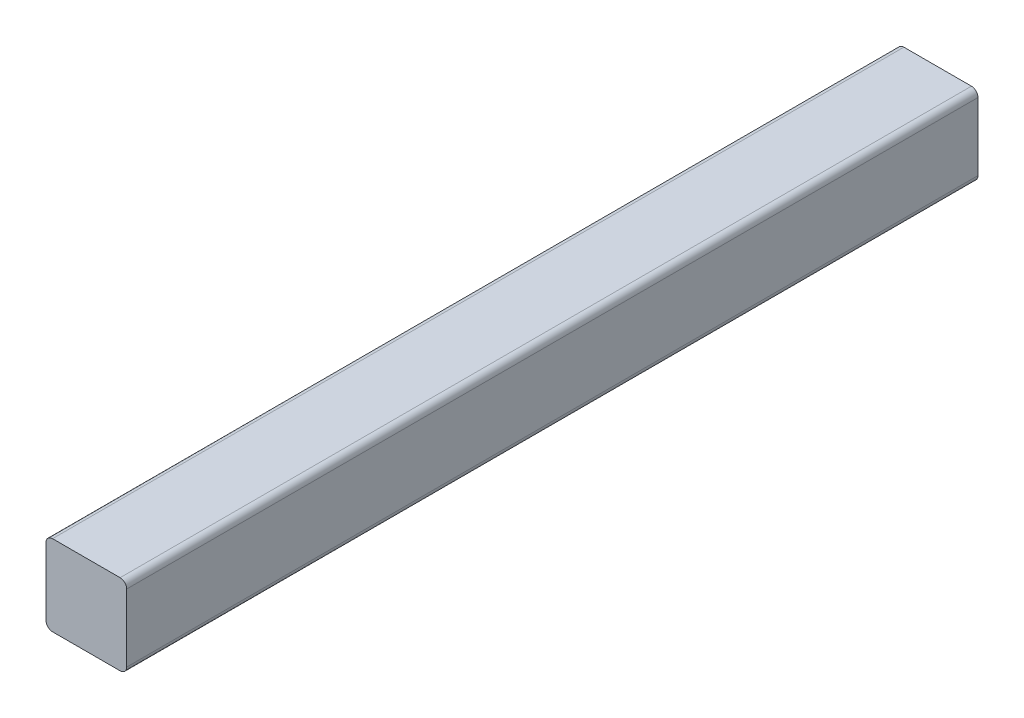
ISO-10303-21;
HEADER;
FILE_DESCRIPTION(('STEP AP214'),'2;1');
FILE_NAME('part.step','',(''),(''),'','','');
FILE_SCHEMA(('AUTOMOTIVE_DESIGN { 1 0 10303 214 1 1 1 1 }'));
ENDSEC;
DATA;
#1=APPLICATION_CONTEXT('core data for automotive mechanical design processes');
#2=APPLICATION_PROTOCOL_DEFINITION('international standard','automotive_design',2000,#1);
#3=PRODUCT_CONTEXT('',#1,'mechanical');
#4=PRODUCT('Part','Part','',(#3));
#5=PRODUCT_RELATED_PRODUCT_CATEGORY('part','',(#4));
#6=PRODUCT_DEFINITION_FORMATION('','',#4);
#7=PRODUCT_DEFINITION_CONTEXT('part definition',#1,'design');
#8=PRODUCT_DEFINITION('design','',#6,#7);
#9=PRODUCT_DEFINITION_SHAPE('','',#8);
#10=(LENGTH_UNIT() NAMED_UNIT(*) SI_UNIT(.MILLI.,.METRE.));
#11=(NAMED_UNIT(*) PLANE_ANGLE_UNIT() SI_UNIT($,.RADIAN.));
#12=(NAMED_UNIT(*) SI_UNIT($,.STERADIAN.) SOLID_ANGLE_UNIT());
#13=UNCERTAINTY_MEASURE_WITH_UNIT(LENGTH_MEASURE(1.E-05),#10,'distance_accuracy_value','');
#14=(GEOMETRIC_REPRESENTATION_CONTEXT(3) GLOBAL_UNCERTAINTY_ASSIGNED_CONTEXT((#13)) GLOBAL_UNIT_ASSIGNED_CONTEXT((#10,
#11,#12)) REPRESENTATION_CONTEXT('',''));
#15=CARTESIAN_POINT('',(0.,0.,0.));
#16=DIRECTION('',(0.,0.,1.));
#17=DIRECTION('',(1.,0.,0.));
#18=AXIS2_PLACEMENT_3D('',#15,#16,#17);
#19=CARTESIAN_POINT('',(2.83,0.25,0.));
#20=DIRECTION('',(0.,0.,1.));
#21=DIRECTION('',(1.,0.,0.));
#22=AXIS2_PLACEMENT_3D('',#19,#20,#21);
#23=PLANE('',#22);
#24=CARTESIAN_POINT('',(2.83,0.25,0.));
#25=DIRECTION('',(0.,0.,1.));
#26=DIRECTION('',(1.,0.,0.));
#27=AXIS2_PLACEMENT_3D('',#24,#25,#26);
#28=CIRCLE('',#27,0.25);
#29=CARTESIAN_POINT('',(2.83,0.,0.));
#30=VERTEX_POINT('',#29);
#31=CARTESIAN_POINT('',(3.08,0.25,0.));
#32=VERTEX_POINT('',#31);
#33=EDGE_CURVE('E160',#30,#32,#28,.T.);
#34=ORIENTED_EDGE('',*,*,#33,.F.);
#35=DIRECTION('',(1.,0.,0.));
#36=VECTOR('',#35,1.);
#37=CARTESIAN_POINT('',(0.250000000000002,0.,0.));
#38=LINE('',#37,#36);
#39=CARTESIAN_POINT('',(0.250000000000002,0.,0.));
#40=VERTEX_POINT('',#39);
#41=EDGE_CURVE('E104',#40,#30,#38,.T.);
#42=ORIENTED_EDGE('',*,*,#41,.F.);
#43=CARTESIAN_POINT('',(0.25,0.25,0.));
#44=DIRECTION('',(0.,0.,1.));
#45=DIRECTION('',(1.,0.,0.));
#46=AXIS2_PLACEMENT_3D('',#43,#44,#45);
#47=CIRCLE('',#46,0.25);
#48=CARTESIAN_POINT('',(0.,0.250000000000002,0.));
#49=VERTEX_POINT('',#48);
#50=EDGE_CURVE('E98',#49,#40,#47,.T.);
#51=ORIENTED_EDGE('',*,*,#50,.F.);
#52=DIRECTION('',(0.,-1.,0.));
#53=VECTOR('',#52,1.);
#54=CARTESIAN_POINT('',(0.,0.250000000000002,0.));
#55=LINE('',#54,#53);
#56=CARTESIAN_POINT('',(0.,2.83,0.));
#57=VERTEX_POINT('',#56);
#58=EDGE_CURVE('E145',#57,#49,#55,.T.);
#59=ORIENTED_EDGE('',*,*,#58,.F.);
#60=CARTESIAN_POINT('',(0.25,2.83,0.));
#61=DIRECTION('',(0.,0.,1.));
#62=DIRECTION('',(1.,0.,0.));
#63=AXIS2_PLACEMENT_3D('',#60,#61,#62);
#64=CIRCLE('',#63,0.25);
#65=CARTESIAN_POINT('',(0.25,3.08,0.));
#66=VERTEX_POINT('',#65);
#67=EDGE_CURVE('E174',#66,#57,#64,.T.);
#68=ORIENTED_EDGE('',*,*,#67,.F.);
#69=DIRECTION('',(-1.,0.,0.));
#70=VECTOR('',#69,1.);
#71=CARTESIAN_POINT('',(0.25,3.08,0.));
#72=LINE('',#71,#70);
#73=CARTESIAN_POINT('',(2.83,3.08,0.));
#74=VERTEX_POINT('',#73);
#75=EDGE_CURVE('E171',#74,#66,#72,.T.);
#76=ORIENTED_EDGE('',*,*,#75,.F.);
#77=CARTESIAN_POINT('',(2.83,2.83,0.));
#78=DIRECTION('',(0.,0.,1.));
#79=DIRECTION('',(-1.,0.,0.));
#80=AXIS2_PLACEMENT_3D('',#77,#78,#79);
#81=CIRCLE('',#80,0.25);
#82=CARTESIAN_POINT('',(3.08,2.83,0.));
#83=VERTEX_POINT('',#82);
#84=EDGE_CURVE('E168',#83,#74,#81,.T.);
#85=ORIENTED_EDGE('',*,*,#84,.F.);
#86=DIRECTION('',(0.,1.,0.));
#87=VECTOR('',#86,1.);
#88=CARTESIAN_POINT('',(3.08,0.25,0.));
#89=LINE('',#88,#87);
#90=EDGE_CURVE('E164',#32,#83,#89,.T.);
#91=ORIENTED_EDGE('',*,*,#90,.F.);
#92=EDGE_LOOP('',(#34,#42,#51,#59,#68,#76,#85,#91));
#93=FACE_BOUND('',#92,.T.);
#94=CARTESIAN_POINT('',(1.54,1.54,0.));
#95=DIRECTION('',(0.,0.,1.));
#96=DIRECTION('',(1.,0.,0.));
#97=AXIS2_PLACEMENT_3D('',#94,#95,#96);
#98=CIRCLE('',#97,0.5);
#99=CARTESIAN_POINT('',(2.04,1.54,0.));
#100=VERTEX_POINT('',#99);
#101=EDGE_CURVE('E11',#100,#100,#98,.F.);
#102=ORIENTED_EDGE('',*,*,#101,.F.);
#103=EDGE_LOOP('',(#102));
#104=FACE_BOUND('',#103,.T.);
#105=ADVANCED_FACE('F39',(#93,#104),#23,.F.);
#106=CARTESIAN_POINT('',(2.83,0.25,32.5));
#107=DIRECTION('',(0.,0.,-1.));
#108=DIRECTION('',(-1.,0.,0.));
#109=AXIS2_PLACEMENT_3D('',#106,#107,#108);
#110=CYLINDRICAL_SURFACE('',#109,0.25);
#111=ORIENTED_EDGE('',*,*,#33,.T.);
#112=DIRECTION('',(0.,0.,-1.));
#113=VECTOR('',#112,1.);
#114=CARTESIAN_POINT('',(3.08,0.25,32.5));
#115=LINE('',#114,#113);
#116=CARTESIAN_POINT('',(3.08,0.25,32.5));
#117=VERTEX_POINT('',#116);
#118=EDGE_CURVE('E49',#117,#32,#115,.T.);
#119=ORIENTED_EDGE('',*,*,#118,.F.);
#120=CARTESIAN_POINT('',(2.83,0.25,32.5));
#121=DIRECTION('',(0.,0.,1.));
#122=DIRECTION('',(1.,0.,0.));
#123=AXIS2_PLACEMENT_3D('',#120,#121,#122);
#124=CIRCLE('',#123,0.25);
#125=CARTESIAN_POINT('',(2.83,0.,32.5));
#126=VERTEX_POINT('',#125);
#127=EDGE_CURVE('E183',#126,#117,#124,.T.);
#128=ORIENTED_EDGE('',*,*,#127,.F.);
#129=DIRECTION('',(0.,0.,-1.));
#130=VECTOR('',#129,1.);
#131=CARTESIAN_POINT('',(2.83,0.,32.5));
#132=LINE('',#131,#130);
#133=EDGE_CURVE('E156',#126,#30,#132,.T.);
#134=ORIENTED_EDGE('',*,*,#133,.T.);
#135=EDGE_LOOP('',(#111,#119,#128,#134));
#136=FACE_BOUND('',#135,.T.);
#137=ADVANCED_FACE('F41',(#136),#110,.T.);
#138=CARTESIAN_POINT('',(3.08,0.25,32.5));
#139=DIRECTION('',(-1.,0.,0.));
#140=DIRECTION('',(0.,0.,1.));
#141=AXIS2_PLACEMENT_3D('',#138,#139,#140);
#142=PLANE('',#141);
#143=ORIENTED_EDGE('',*,*,#90,.T.);
#144=DIRECTION('',(0.,0.,-1.));
#145=VECTOR('',#144,1.);
#146=CARTESIAN_POINT('',(3.08,2.83,32.5));
#147=LINE('',#146,#145);
#148=CARTESIAN_POINT('',(3.08,2.83,32.5));
#149=VERTEX_POINT('',#148);
#150=EDGE_CURVE('E198',#149,#83,#147,.T.);
#151=ORIENTED_EDGE('',*,*,#150,.F.);
#152=DIRECTION('',(0.,1.,0.));
#153=VECTOR('',#152,1.);
#154=CARTESIAN_POINT('',(3.08,0.25,32.5));
#155=LINE('',#154,#153);
#156=EDGE_CURVE('E113',#117,#149,#155,.T.);
#157=ORIENTED_EDGE('',*,*,#156,.F.);
#158=ORIENTED_EDGE('',*,*,#118,.T.);
#159=EDGE_LOOP('',(#143,#151,#157,#158));
#160=FACE_BOUND('',#159,.T.);
#161=ADVANCED_FACE('F203',(#160),#142,.F.);
#162=CARTESIAN_POINT('',(2.83,2.83,32.5));
#163=DIRECTION('',(0.,0.,-1.));
#164=DIRECTION('',(-1.,0.,0.));
#165=AXIS2_PLACEMENT_3D('',#162,#163,#164);
#166=CYLINDRICAL_SURFACE('',#165,0.25);
#167=ORIENTED_EDGE('',*,*,#84,.T.);
#168=DIRECTION('',(0.,0.,-1.));
#169=VECTOR('',#168,1.);
#170=CARTESIAN_POINT('',(2.83,3.08,32.5));
#171=LINE('',#170,#169);
#172=CARTESIAN_POINT('',(2.83,3.08,32.5));
#173=VERTEX_POINT('',#172);
#174=EDGE_CURVE('E194',#173,#74,#171,.T.);
#175=ORIENTED_EDGE('',*,*,#174,.F.);
#176=CARTESIAN_POINT('',(2.83,2.83,32.5));
#177=DIRECTION('',(0.,0.,1.));
#178=DIRECTION('',(-1.,0.,0.));
#179=AXIS2_PLACEMENT_3D('',#176,#177,#178);
#180=CIRCLE('',#179,0.25);
#181=EDGE_CURVE('E221',#149,#173,#180,.T.);
#182=ORIENTED_EDGE('',*,*,#181,.F.);
#183=ORIENTED_EDGE('',*,*,#150,.T.);
#184=EDGE_LOOP('',(#167,#175,#182,#183));
#185=FACE_BOUND('',#184,.T.);
#186=ADVANCED_FACE('F214',(#185),#166,.T.);
#187=CARTESIAN_POINT('',(0.25,3.08,32.5));
#188=DIRECTION('',(0.,-1.,0.));
#189=DIRECTION('',(0.,0.,-1.));
#190=AXIS2_PLACEMENT_3D('',#187,#188,#189);
#191=PLANE('',#190);
#192=ORIENTED_EDGE('',*,*,#75,.T.);
#193=DIRECTION('',(0.,0.,-1.));
#194=VECTOR('',#193,1.);
#195=CARTESIAN_POINT('',(0.25,3.08,32.5));
#196=LINE('',#195,#194);
#197=CARTESIAN_POINT('',(0.25,3.08,32.5));
#198=VERTEX_POINT('',#197);
#199=EDGE_CURVE('E190',#198,#66,#196,.T.);
#200=ORIENTED_EDGE('',*,*,#199,.F.);
#201=DIRECTION('',(-1.,0.,0.));
#202=VECTOR('',#201,1.);
#203=CARTESIAN_POINT('',(0.25,3.08,32.5));
#204=LINE('',#203,#202);
#205=EDGE_CURVE('E220',#173,#198,#204,.T.);
#206=ORIENTED_EDGE('',*,*,#205,.F.);
#207=ORIENTED_EDGE('',*,*,#174,.T.);
#208=EDGE_LOOP('',(#192,#200,#206,#207));
#209=FACE_BOUND('',#208,.T.);
#210=ADVANCED_FACE('F218',(#209),#191,.F.);
#211=CARTESIAN_POINT('',(0.25,2.83,32.5));
#212=DIRECTION('',(0.,0.,-1.));
#213=DIRECTION('',(-1.,0.,0.));
#214=AXIS2_PLACEMENT_3D('',#211,#212,#213);
#215=CYLINDRICAL_SURFACE('',#214,0.25);
#216=ORIENTED_EDGE('',*,*,#67,.T.);
#217=DIRECTION('',(0.,0.,-1.));
#218=VECTOR('',#217,1.);
#219=CARTESIAN_POINT('',(0.,2.83,32.5));
#220=LINE('',#219,#218);
#221=CARTESIAN_POINT('',(0.,2.83,32.5));
#222=VERTEX_POINT('',#221);
#223=EDGE_CURVE('E147',#222,#57,#220,.T.);
#224=ORIENTED_EDGE('',*,*,#223,.F.);
#225=CARTESIAN_POINT('',(0.25,2.83,32.5));
#226=DIRECTION('',(0.,0.,1.));
#227=DIRECTION('',(1.,0.,0.));
#228=AXIS2_PLACEMENT_3D('',#225,#226,#227);
#229=CIRCLE('',#228,0.25);
#230=EDGE_CURVE('E136',#198,#222,#229,.T.);
#231=ORIENTED_EDGE('',*,*,#230,.F.);
#232=ORIENTED_EDGE('',*,*,#199,.T.);
#233=EDGE_LOOP('',(#216,#224,#231,#232));
#234=FACE_BOUND('',#233,.T.);
#235=ADVANCED_FACE('F255',(#234),#215,.T.);
#236=CARTESIAN_POINT('',(0.,0.250000000000002,32.5));
#237=DIRECTION('',(1.,0.,0.));
#238=DIRECTION('',(0.,0.,-1.));
#239=AXIS2_PLACEMENT_3D('',#236,#237,#238);
#240=PLANE('',#239);
#241=ORIENTED_EDGE('',*,*,#58,.T.);
#242=DIRECTION('',(0.,0.,-1.));
#243=VECTOR('',#242,1.);
#244=CARTESIAN_POINT('',(0.,0.250000000000002,32.5));
#245=LINE('',#244,#243);
#246=CARTESIAN_POINT('',(0.,0.250000000000002,32.5));
#247=VERTEX_POINT('',#246);
#248=EDGE_CURVE('E142',#247,#49,#245,.T.);
#249=ORIENTED_EDGE('',*,*,#248,.F.);
#250=DIRECTION('',(0.,-1.,0.));
#251=VECTOR('',#250,1.);
#252=CARTESIAN_POINT('',(0.,0.250000000000002,32.5));
#253=LINE('',#252,#251);
#254=EDGE_CURVE('E130',#222,#247,#253,.T.);
#255=ORIENTED_EDGE('',*,*,#254,.F.);
#256=ORIENTED_EDGE('',*,*,#223,.T.);
#257=EDGE_LOOP('',(#241,#249,#255,#256));
#258=FACE_BOUND('',#257,.T.);
#259=ADVANCED_FACE('F143',(#258),#240,.F.);
#260=CARTESIAN_POINT('',(0.25,0.25,32.5));
#261=DIRECTION('',(0.,0.,-1.));
#262=DIRECTION('',(-1.,0.,0.));
#263=AXIS2_PLACEMENT_3D('',#260,#261,#262);
#264=CYLINDRICAL_SURFACE('',#263,0.25);
#265=ORIENTED_EDGE('',*,*,#50,.T.);
#266=DIRECTION('',(0.,0.,-1.));
#267=VECTOR('',#266,1.);
#268=CARTESIAN_POINT('',(0.250000000000002,0.,32.5));
#269=LINE('',#268,#267);
#270=CARTESIAN_POINT('',(0.250000000000002,0.,32.5));
#271=VERTEX_POINT('',#270);
#272=EDGE_CURVE('E148',#271,#40,#269,.T.);
#273=ORIENTED_EDGE('',*,*,#272,.F.);
#274=CARTESIAN_POINT('',(0.25,0.25,32.5));
#275=DIRECTION('',(0.,0.,1.));
#276=DIRECTION('',(1.,0.,0.));
#277=AXIS2_PLACEMENT_3D('',#274,#275,#276);
#278=CIRCLE('',#277,0.25);
#279=EDGE_CURVE('E134',#247,#271,#278,.T.);
#280=ORIENTED_EDGE('',*,*,#279,.F.);
#281=ORIENTED_EDGE('',*,*,#248,.T.);
#282=EDGE_LOOP('',(#265,#273,#280,#281));
#283=FACE_BOUND('',#282,.T.);
#284=ADVANCED_FACE('F150',(#283),#264,.T.);
#285=CARTESIAN_POINT('',(0.250000000000002,0.,32.5));
#286=DIRECTION('',(0.,1.,0.));
#287=DIRECTION('',(0.,0.,1.));
#288=AXIS2_PLACEMENT_3D('',#285,#286,#287);
#289=PLANE('',#288);
#290=ORIENTED_EDGE('',*,*,#41,.T.);
#291=ORIENTED_EDGE('',*,*,#133,.F.);
#292=DIRECTION('',(1.,0.,0.));
#293=VECTOR('',#292,1.);
#294=CARTESIAN_POINT('',(0.250000000000002,0.,32.5));
#295=LINE('',#294,#293);
#296=EDGE_CURVE('E60',#271,#126,#295,.T.);
#297=ORIENTED_EDGE('',*,*,#296,.F.);
#298=ORIENTED_EDGE('',*,*,#272,.T.);
#299=EDGE_LOOP('',(#290,#291,#297,#298));
#300=FACE_BOUND('',#299,.T.);
#301=ADVANCED_FACE('F248',(#300),#289,.F.);
#302=CARTESIAN_POINT('',(2.83,0.25,32.5));
#303=DIRECTION('',(0.,0.,1.));
#304=DIRECTION('',(1.,0.,0.));
#305=AXIS2_PLACEMENT_3D('',#302,#303,#304);
#306=PLANE('',#305);
#307=ORIENTED_EDGE('',*,*,#127,.T.);
#308=ORIENTED_EDGE('',*,*,#156,.T.);
#309=ORIENTED_EDGE('',*,*,#181,.T.);
#310=ORIENTED_EDGE('',*,*,#205,.T.);
#311=ORIENTED_EDGE('',*,*,#230,.T.);
#312=ORIENTED_EDGE('',*,*,#254,.T.);
#313=ORIENTED_EDGE('',*,*,#279,.T.);
#314=ORIENTED_EDGE('',*,*,#296,.T.);
#315=EDGE_LOOP('',(#307,#308,#309,#310,#311,#312,#313,#314));
#316=FACE_BOUND('',#315,.T.);
#317=ADVANCED_FACE('F132',(#316),#306,.T.);
#318=CARTESIAN_POINT('',(1.54,1.54,-1.));
#319=DIRECTION('',(0.,0.,1.));
#320=DIRECTION('',(1.,0.,0.));
#321=AXIS2_PLACEMENT_3D('',#318,#319,#320);
#322=CYLINDRICAL_SURFACE('',#321,0.5);
#323=CARTESIAN_POINT('',(1.54,1.54,-1.));
#324=DIRECTION('',(0.,0.,-1.));
#325=DIRECTION('',(-1.,0.,0.));
#326=AXIS2_PLACEMENT_3D('',#323,#324,#325);
#327=CIRCLE('',#326,0.5);
#328=CARTESIAN_POINT('',(1.04,1.54,-1.));
#329=VERTEX_POINT('',#328);
#330=EDGE_CURVE('E165',#329,#329,#327,.T.);
#331=ORIENTED_EDGE('',*,*,#330,.F.);
#332=EDGE_LOOP('',(#331));
#333=FACE_BOUND('',#332,.T.);
#334=ORIENTED_EDGE('',*,*,#101,.T.);
#335=EDGE_LOOP('',(#334));
#336=FACE_BOUND('',#335,.T.);
#337=ADVANCED_FACE('F236',(#333,#336),#322,.T.);
#338=CARTESIAN_POINT('',(1.54,1.54,-1.));
#339=DIRECTION('',(0.,0.,-1.));
#340=DIRECTION('',(-1.,0.,0.));
#341=AXIS2_PLACEMENT_3D('',#338,#339,#340);
#342=PLANE('',#341);
#343=ORIENTED_EDGE('',*,*,#330,.T.);
#344=EDGE_LOOP('',(#343));
#345=FACE_BOUND('',#344,.T.);
#346=ADVANCED_FACE('F234',(#345),#342,.T.);
#347=CLOSED_SHELL('',(#105,#137,#161,#186,#210,#235,#259,#284,#301,#317,#337,#346));
#348=MANIFOLD_SOLID_BREP('B2',#347);
#349=ADVANCED_BREP_SHAPE_REPRESENTATION('',(#18,#348),#14);
#350=SHAPE_DEFINITION_REPRESENTATION(#9,#349);
ENDSEC;
END-ISO-10303-21;
